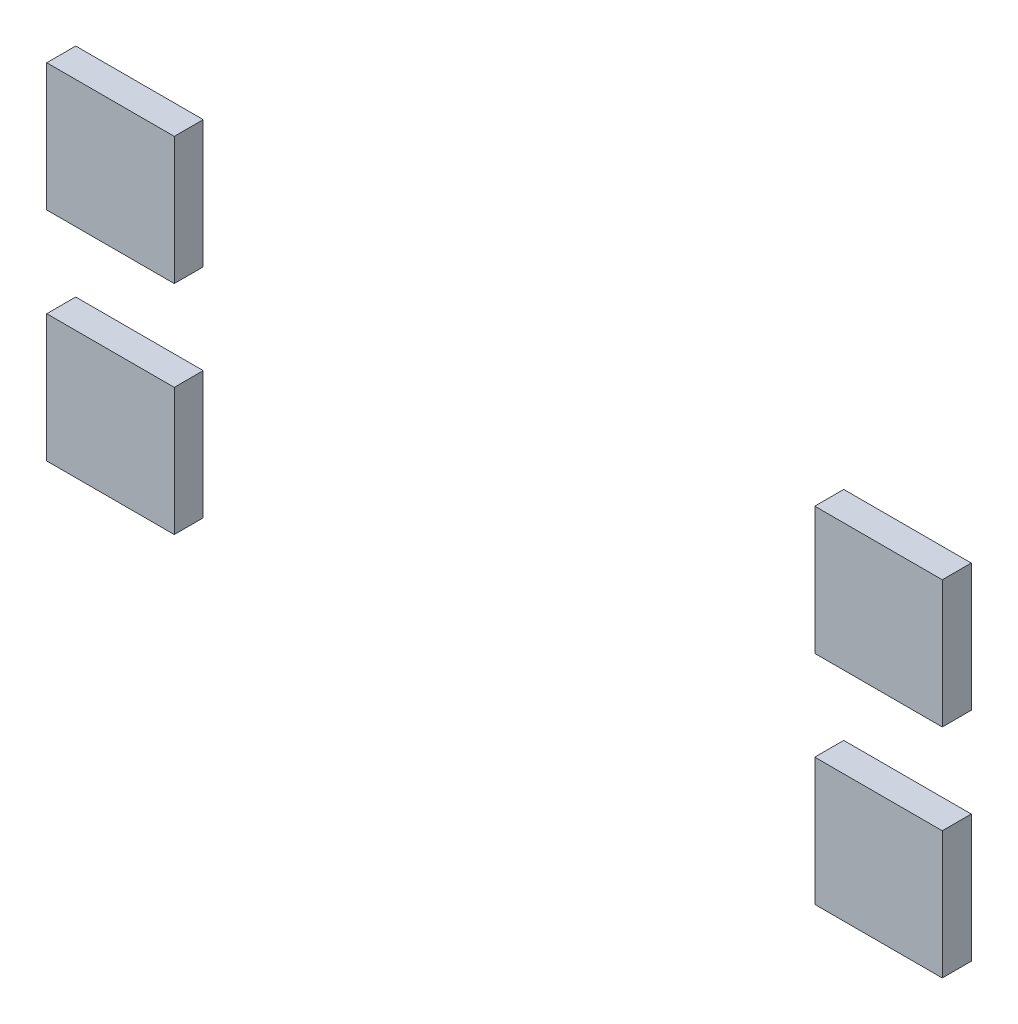
ISO-10303-21;
HEADER;
FILE_DESCRIPTION(('STEP AP214'),'2;1');
FILE_NAME('part.step','',(''),(''),'','','');
FILE_SCHEMA(('AUTOMOTIVE_DESIGN { 1 0 10303 214 1 1 1 1 }'));
ENDSEC;
DATA;
#1=APPLICATION_CONTEXT('core data for automotive mechanical design processes');
#2=APPLICATION_PROTOCOL_DEFINITION('international standard','automotive_design',2000,#1);
#3=PRODUCT_CONTEXT('',#1,'mechanical');
#4=PRODUCT('Part','Part','',(#3));
#5=PRODUCT_RELATED_PRODUCT_CATEGORY('part','',(#4));
#6=PRODUCT_DEFINITION_FORMATION('','',#4);
#7=PRODUCT_DEFINITION_CONTEXT('part definition',#1,'design');
#8=PRODUCT_DEFINITION('design','',#6,#7);
#9=PRODUCT_DEFINITION_SHAPE('','',#8);
#10=(LENGTH_UNIT() NAMED_UNIT(*) SI_UNIT(.MILLI.,.METRE.));
#11=(NAMED_UNIT(*) PLANE_ANGLE_UNIT() SI_UNIT($,.RADIAN.));
#12=(NAMED_UNIT(*) SI_UNIT($,.STERADIAN.) SOLID_ANGLE_UNIT());
#13=UNCERTAINTY_MEASURE_WITH_UNIT(LENGTH_MEASURE(1.E-05),#10,'distance_accuracy_value','');
#14=(GEOMETRIC_REPRESENTATION_CONTEXT(3) GLOBAL_UNCERTAINTY_ASSIGNED_CONTEXT((#13)) GLOBAL_UNIT_ASSIGNED_CONTEXT((#10,
#11,#12)) REPRESENTATION_CONTEXT('',''));
#15=CARTESIAN_POINT('',(0.,0.,0.));
#16=DIRECTION('',(0.,0.,1.));
#17=DIRECTION('',(1.,0.,0.));
#18=AXIS2_PLACEMENT_3D('',#15,#16,#17);
#19=CARTESIAN_POINT('',(-1.545,0.155,0.1));
#20=DIRECTION('',(0.,0.,1.));
#21=DIRECTION('',(1.,0.,0.));
#22=AXIS2_PLACEMENT_3D('',#19,#20,#21);
#23=PLANE('',#22);
#24=DIRECTION('',(0.,1.,0.));
#25=VECTOR('',#24,1.);
#26=CARTESIAN_POINT('',(-1.545,0.155,0.1));
#27=LINE('',#26,#25);
#28=CARTESIAN_POINT('',(-1.545,0.155,0.1));
#29=VERTEX_POINT('',#28);
#30=CARTESIAN_POINT('',(-1.545,0.595,0.1));
#31=VERTEX_POINT('',#30);
#32=EDGE_CURVE('P0_E94',#29,#31,#27,.T.);
#33=ORIENTED_EDGE('',*,*,#32,.F.);
#34=DIRECTION('',(1.,0.,0.));
#35=VECTOR('',#34,1.);
#36=CARTESIAN_POINT('',(-1.545,0.155,0.1));
#37=LINE('',#36,#35);
#38=CARTESIAN_POINT('',(-1.105,0.155,0.1));
#39=VERTEX_POINT('',#38);
#40=EDGE_CURVE('P0_E79',#29,#39,#37,.T.);
#41=ORIENTED_EDGE('',*,*,#40,.T.);
#42=DIRECTION('',(0.,1.,0.));
#43=VECTOR('',#42,1.);
#44=CARTESIAN_POINT('',(-1.105,0.155,0.1));
#45=LINE('',#44,#43);
#46=CARTESIAN_POINT('',(-1.105,0.595,0.1));
#47=VERTEX_POINT('',#46);
#48=EDGE_CURVE('P0_E80',#39,#47,#45,.T.);
#49=ORIENTED_EDGE('',*,*,#48,.T.);
#50=DIRECTION('',(1.,0.,0.));
#51=VECTOR('',#50,1.);
#52=CARTESIAN_POINT('',(-1.545,0.595,0.1));
#53=LINE('',#52,#51);
#54=EDGE_CURVE('P0_E11',#31,#47,#53,.T.);
#55=ORIENTED_EDGE('',*,*,#54,.F.);
#56=EDGE_LOOP('',(#33,#41,#49,#55));
#57=FACE_BOUND('',#56,.T.);
#58=ADVANCED_FACE('P0_F17',(#57),#23,.T.);
#59=CARTESIAN_POINT('',(-1.545,0.155,0.));
#60=DIRECTION('',(0.,0.,1.));
#61=DIRECTION('',(1.,0.,0.));
#62=AXIS2_PLACEMENT_3D('',#59,#60,#61);
#63=PLANE('',#62);
#64=DIRECTION('',(0.,1.,0.));
#65=VECTOR('',#64,1.);
#66=CARTESIAN_POINT('',(-1.545,0.155,0.));
#67=LINE('',#66,#65);
#68=CARTESIAN_POINT('',(-1.545,0.155,0.));
#69=VERTEX_POINT('',#68);
#70=CARTESIAN_POINT('',(-1.545,0.595,0.));
#71=VERTEX_POINT('',#70);
#72=EDGE_CURVE('P0_E70',#69,#71,#67,.T.);
#73=ORIENTED_EDGE('',*,*,#72,.T.);
#74=DIRECTION('',(1.,0.,0.));
#75=VECTOR('',#74,1.);
#76=CARTESIAN_POINT('',(-1.545,0.595,0.));
#77=LINE('',#76,#75);
#78=CARTESIAN_POINT('',(-1.105,0.595,0.));
#79=VERTEX_POINT('',#78);
#80=EDGE_CURVE('P0_E25',#71,#79,#77,.T.);
#81=ORIENTED_EDGE('',*,*,#80,.T.);
#82=DIRECTION('',(0.,1.,0.));
#83=VECTOR('',#82,1.);
#84=CARTESIAN_POINT('',(-1.105,0.155,0.));
#85=LINE('',#84,#83);
#86=CARTESIAN_POINT('',(-1.105,0.155,0.));
#87=VERTEX_POINT('',#86);
#88=EDGE_CURVE('P0_E73',#87,#79,#85,.T.);
#89=ORIENTED_EDGE('',*,*,#88,.F.);
#90=DIRECTION('',(1.,0.,0.));
#91=VECTOR('',#90,1.);
#92=CARTESIAN_POINT('',(-1.545,0.155,0.));
#93=LINE('',#92,#91);
#94=EDGE_CURVE('P0_E67',#69,#87,#93,.T.);
#95=ORIENTED_EDGE('',*,*,#94,.F.);
#96=EDGE_LOOP('',(#73,#81,#89,#95));
#97=FACE_BOUND('',#96,.T.);
#98=ADVANCED_FACE('P0_F69',(#97),#63,.F.);
#99=CARTESIAN_POINT('',(-1.545,0.595,0.));
#100=DIRECTION('',(0.,1.,0.));
#101=DIRECTION('',(1.,0.,0.));
#102=AXIS2_PLACEMENT_3D('',#99,#100,#101);
#103=PLANE('',#102);
#104=ORIENTED_EDGE('',*,*,#80,.F.);
#105=DIRECTION('',(0.,0.,1.));
#106=VECTOR('',#105,1.);
#107=CARTESIAN_POINT('',(-1.545,0.595,0.));
#108=LINE('',#107,#106);
#109=EDGE_CURVE('P0_E87',#71,#31,#108,.T.);
#110=ORIENTED_EDGE('',*,*,#109,.T.);
#111=ORIENTED_EDGE('',*,*,#54,.T.);
#112=DIRECTION('',(0.,0.,1.));
#113=VECTOR('',#112,1.);
#114=CARTESIAN_POINT('',(-1.105,0.595,0.));
#115=LINE('',#114,#113);
#116=EDGE_CURVE('P0_E105',#79,#47,#115,.T.);
#117=ORIENTED_EDGE('',*,*,#116,.F.);
#118=EDGE_LOOP('',(#104,#110,#111,#117));
#119=FACE_BOUND('',#118,.T.);
#120=ADVANCED_FACE('P0_F157',(#119),#103,.T.);
#121=CARTESIAN_POINT('',(-1.545,0.155,0.));
#122=DIRECTION('',(0.,1.,0.));
#123=DIRECTION('',(1.,0.,0.));
#124=AXIS2_PLACEMENT_3D('',#121,#122,#123);
#125=PLANE('',#124);
#126=ORIENTED_EDGE('',*,*,#94,.T.);
#127=DIRECTION('',(0.,0.,1.));
#128=VECTOR('',#127,1.);
#129=CARTESIAN_POINT('',(-1.105,0.155,0.));
#130=LINE('',#129,#128);
#131=EDGE_CURVE('P0_E89',#87,#39,#130,.T.);
#132=ORIENTED_EDGE('',*,*,#131,.T.);
#133=ORIENTED_EDGE('',*,*,#40,.F.);
#134=DIRECTION('',(0.,0.,1.));
#135=VECTOR('',#134,1.);
#136=CARTESIAN_POINT('',(-1.545,0.155,0.));
#137=LINE('',#136,#135);
#138=EDGE_CURVE('P0_E86',#69,#29,#137,.T.);
#139=ORIENTED_EDGE('',*,*,#138,.F.);
#140=EDGE_LOOP('',(#126,#132,#133,#139));
#141=FACE_BOUND('',#140,.T.);
#142=ADVANCED_FACE('P0_F91',(#141),#125,.F.);
#143=CARTESIAN_POINT('',(-1.105,0.155,0.));
#144=DIRECTION('',(1.,0.,0.));
#145=DIRECTION('',(0.,1.,0.));
#146=AXIS2_PLACEMENT_3D('',#143,#144,#145);
#147=PLANE('',#146);
#148=ORIENTED_EDGE('',*,*,#131,.F.);
#149=ORIENTED_EDGE('',*,*,#88,.T.);
#150=ORIENTED_EDGE('',*,*,#116,.T.);
#151=ORIENTED_EDGE('',*,*,#48,.F.);
#152=EDGE_LOOP('',(#148,#149,#150,#151));
#153=FACE_BOUND('',#152,.T.);
#154=ADVANCED_FACE('P0_F156',(#153),#147,.T.);
#155=CARTESIAN_POINT('',(-1.545,0.155,0.));
#156=DIRECTION('',(1.,0.,0.));
#157=DIRECTION('',(0.,1.,0.));
#158=AXIS2_PLACEMENT_3D('',#155,#156,#157);
#159=PLANE('',#158);
#160=ORIENTED_EDGE('',*,*,#138,.T.);
#161=ORIENTED_EDGE('',*,*,#32,.T.);
#162=ORIENTED_EDGE('',*,*,#109,.F.);
#163=ORIENTED_EDGE('',*,*,#72,.F.);
#164=EDGE_LOOP('',(#160,#161,#162,#163));
#165=FACE_BOUND('',#164,.T.);
#166=ADVANCED_FACE('P0_F84',(#165),#159,.F.);
#167=CLOSED_SHELL('',(#58,#98,#120,#142,#154,#166));
#168=MANIFOLD_SOLID_BREP('P0_B1',#167);
#169=CARTESIAN_POINT('',(1.105,0.155,0.1));
#170=DIRECTION('',(0.,0.,1.));
#171=DIRECTION('',(1.,0.,0.));
#172=AXIS2_PLACEMENT_3D('',#169,#170,#171);
#173=PLANE('',#172);
#174=DIRECTION('',(0.,1.,0.));
#175=VECTOR('',#174,1.);
#176=CARTESIAN_POINT('',(1.105,0.155,0.1));
#177=LINE('',#176,#175);
#178=CARTESIAN_POINT('',(1.105,0.155,0.1));
#179=VERTEX_POINT('',#178);
#180=CARTESIAN_POINT('',(1.105,0.595,0.1));
#181=VERTEX_POINT('',#180);
#182=EDGE_CURVE('P1_E115',#179,#181,#177,.T.);
#183=ORIENTED_EDGE('',*,*,#182,.F.);
#184=DIRECTION('',(1.,0.,0.));
#185=VECTOR('',#184,1.);
#186=CARTESIAN_POINT('',(1.105,0.155,0.1));
#187=LINE('',#186,#185);
#188=CARTESIAN_POINT('',(1.545,0.155,0.1));
#189=VERTEX_POINT('',#188);
#190=EDGE_CURVE('P1_E80',#179,#189,#187,.T.);
#191=ORIENTED_EDGE('',*,*,#190,.T.);
#192=DIRECTION('',(0.,1.,0.));
#193=VECTOR('',#192,1.);
#194=CARTESIAN_POINT('',(1.545,0.155,0.1));
#195=LINE('',#194,#193);
#196=CARTESIAN_POINT('',(1.545,0.595,0.1));
#197=VERTEX_POINT('',#196);
#198=EDGE_CURVE('P1_E81',#189,#197,#195,.T.);
#199=ORIENTED_EDGE('',*,*,#198,.T.);
#200=DIRECTION('',(1.,0.,0.));
#201=VECTOR('',#200,1.);
#202=CARTESIAN_POINT('',(1.105,0.595,0.1));
#203=LINE('',#202,#201);
#204=EDGE_CURVE('P1_E11',#181,#197,#203,.T.);
#205=ORIENTED_EDGE('',*,*,#204,.F.);
#206=EDGE_LOOP('',(#183,#191,#199,#205));
#207=FACE_BOUND('',#206,.T.);
#208=ADVANCED_FACE('P1_F17',(#207),#173,.T.);
#209=CARTESIAN_POINT('',(1.105,0.155,0.));
#210=DIRECTION('',(0.,0.,1.));
#211=DIRECTION('',(1.,0.,0.));
#212=AXIS2_PLACEMENT_3D('',#209,#210,#211);
#213=PLANE('',#212);
#214=DIRECTION('',(0.,1.,0.));
#215=VECTOR('',#214,1.);
#216=CARTESIAN_POINT('',(1.105,0.155,0.));
#217=LINE('',#216,#215);
#218=CARTESIAN_POINT('',(1.105,0.155,0.));
#219=VERTEX_POINT('',#218);
#220=CARTESIAN_POINT('',(1.105,0.595,0.));
#221=VERTEX_POINT('',#220);
#222=EDGE_CURVE('P1_E93',#219,#221,#217,.T.);
#223=ORIENTED_EDGE('',*,*,#222,.T.);
#224=DIRECTION('',(1.,0.,0.));
#225=VECTOR('',#224,1.);
#226=CARTESIAN_POINT('',(1.105,0.595,0.));
#227=LINE('',#226,#225);
#228=CARTESIAN_POINT('',(1.545,0.595,0.));
#229=VERTEX_POINT('',#228);
#230=EDGE_CURVE('P1_E21',#221,#229,#227,.T.);
#231=ORIENTED_EDGE('',*,*,#230,.T.);
#232=DIRECTION('',(0.,1.,0.));
#233=VECTOR('',#232,1.);
#234=CARTESIAN_POINT('',(1.545,0.155,0.));
#235=LINE('',#234,#233);
#236=CARTESIAN_POINT('',(1.545,0.155,0.));
#237=VERTEX_POINT('',#236);
#238=EDGE_CURVE('P1_E83',#237,#229,#235,.T.);
#239=ORIENTED_EDGE('',*,*,#238,.F.);
#240=DIRECTION('',(1.,0.,0.));
#241=VECTOR('',#240,1.);
#242=CARTESIAN_POINT('',(1.105,0.155,0.));
#243=LINE('',#242,#241);
#244=EDGE_CURVE('P1_E72',#219,#237,#243,.T.);
#245=ORIENTED_EDGE('',*,*,#244,.F.);
#246=EDGE_LOOP('',(#223,#231,#239,#245));
#247=FACE_BOUND('',#246,.T.);
#248=ADVANCED_FACE('P1_F84',(#247),#213,.F.);
#249=CARTESIAN_POINT('',(1.105,0.595,0.));
#250=DIRECTION('',(0.,1.,0.));
#251=DIRECTION('',(1.,0.,0.));
#252=AXIS2_PLACEMENT_3D('',#249,#250,#251);
#253=PLANE('',#252);
#254=ORIENTED_EDGE('',*,*,#230,.F.);
#255=DIRECTION('',(0.,0.,1.));
#256=VECTOR('',#255,1.);
#257=CARTESIAN_POINT('',(1.105,0.595,0.));
#258=LINE('',#257,#256);
#259=EDGE_CURVE('P1_E99',#221,#181,#258,.T.);
#260=ORIENTED_EDGE('',*,*,#259,.T.);
#261=ORIENTED_EDGE('',*,*,#204,.T.);
#262=DIRECTION('',(0.,0.,1.));
#263=VECTOR('',#262,1.);
#264=CARTESIAN_POINT('',(1.545,0.595,0.));
#265=LINE('',#264,#263);
#266=EDGE_CURVE('P1_E88',#229,#197,#265,.T.);
#267=ORIENTED_EDGE('',*,*,#266,.F.);
#268=EDGE_LOOP('',(#254,#260,#261,#267));
#269=FACE_BOUND('',#268,.T.);
#270=ADVANCED_FACE('P1_F19',(#269),#253,.T.);
#271=CARTESIAN_POINT('',(1.105,0.155,0.));
#272=DIRECTION('',(0.,1.,0.));
#273=DIRECTION('',(1.,0.,0.));
#274=AXIS2_PLACEMENT_3D('',#271,#272,#273);
#275=PLANE('',#274);
#276=ORIENTED_EDGE('',*,*,#244,.T.);
#277=DIRECTION('',(0.,0.,1.));
#278=VECTOR('',#277,1.);
#279=CARTESIAN_POINT('',(1.545,0.155,0.));
#280=LINE('',#279,#278);
#281=EDGE_CURVE('P1_E75',#237,#189,#280,.T.);
#282=ORIENTED_EDGE('',*,*,#281,.T.);
#283=ORIENTED_EDGE('',*,*,#190,.F.);
#284=DIRECTION('',(0.,0.,1.));
#285=VECTOR('',#284,1.);
#286=CARTESIAN_POINT('',(1.105,0.155,0.));
#287=LINE('',#286,#285);
#288=EDGE_CURVE('P1_E77',#219,#179,#287,.T.);
#289=ORIENTED_EDGE('',*,*,#288,.F.);
#290=EDGE_LOOP('',(#276,#282,#283,#289));
#291=FACE_BOUND('',#290,.T.);
#292=ADVANCED_FACE('P1_F73',(#291),#275,.F.);
#293=CARTESIAN_POINT('',(1.545,0.155,0.));
#294=DIRECTION('',(1.,0.,0.));
#295=DIRECTION('',(0.,1.,0.));
#296=AXIS2_PLACEMENT_3D('',#293,#294,#295);
#297=PLANE('',#296);
#298=ORIENTED_EDGE('',*,*,#281,.F.);
#299=ORIENTED_EDGE('',*,*,#238,.T.);
#300=ORIENTED_EDGE('',*,*,#266,.T.);
#301=ORIENTED_EDGE('',*,*,#198,.F.);
#302=EDGE_LOOP('',(#298,#299,#300,#301));
#303=FACE_BOUND('',#302,.T.);
#304=ADVANCED_FACE('P1_F91',(#303),#297,.T.);
#305=CARTESIAN_POINT('',(1.105,0.155,0.));
#306=DIRECTION('',(1.,0.,0.));
#307=DIRECTION('',(0.,1.,0.));
#308=AXIS2_PLACEMENT_3D('',#305,#306,#307);
#309=PLANE('',#308);
#310=ORIENTED_EDGE('',*,*,#288,.T.);
#311=ORIENTED_EDGE('',*,*,#182,.T.);
#312=ORIENTED_EDGE('',*,*,#259,.F.);
#313=ORIENTED_EDGE('',*,*,#222,.F.);
#314=EDGE_LOOP('',(#310,#311,#312,#313));
#315=FACE_BOUND('',#314,.T.);
#316=ADVANCED_FACE('P1_F114',(#315),#309,.F.);
#317=CLOSED_SHELL('',(#208,#248,#270,#292,#304,#316));
#318=MANIFOLD_SOLID_BREP('P1_B1',#317);
#319=CARTESIAN_POINT('',(-1.545,-0.595,0.1));
#320=DIRECTION('',(0.,0.,1.));
#321=DIRECTION('',(1.,0.,0.));
#322=AXIS2_PLACEMENT_3D('',#319,#320,#321);
#323=PLANE('',#322);
#324=DIRECTION('',(0.,1.,0.));
#325=VECTOR('',#324,1.);
#326=CARTESIAN_POINT('',(-1.545,-0.595,0.1));
#327=LINE('',#326,#325);
#328=CARTESIAN_POINT('',(-1.545,-0.595,0.1));
#329=VERTEX_POINT('',#328);
#330=CARTESIAN_POINT('',(-1.545,-0.155,0.1));
#331=VERTEX_POINT('',#330);
#332=EDGE_CURVE('P2_E92',#329,#331,#327,.T.);
#333=ORIENTED_EDGE('',*,*,#332,.F.);
#334=DIRECTION('',(1.,0.,0.));
#335=VECTOR('',#334,1.);
#336=CARTESIAN_POINT('',(-1.545,-0.595,0.1));
#337=LINE('',#336,#335);
#338=CARTESIAN_POINT('',(-1.105,-0.595,0.1));
#339=VERTEX_POINT('',#338);
#340=EDGE_CURVE('P2_E78',#329,#339,#337,.T.);
#341=ORIENTED_EDGE('',*,*,#340,.T.);
#342=DIRECTION('',(0.,1.,0.));
#343=VECTOR('',#342,1.);
#344=CARTESIAN_POINT('',(-1.105,-0.595,0.1));
#345=LINE('',#344,#343);
#346=CARTESIAN_POINT('',(-1.105,-0.155,0.1));
#347=VERTEX_POINT('',#346);
#348=EDGE_CURVE('P2_E79',#339,#347,#345,.T.);
#349=ORIENTED_EDGE('',*,*,#348,.T.);
#350=DIRECTION('',(1.,0.,0.));
#351=VECTOR('',#350,1.);
#352=CARTESIAN_POINT('',(-1.545,-0.155,0.1));
#353=LINE('',#352,#351);
#354=EDGE_CURVE('P2_E11',#331,#347,#353,.T.);
#355=ORIENTED_EDGE('',*,*,#354,.F.);
#356=EDGE_LOOP('',(#333,#341,#349,#355));
#357=FACE_BOUND('',#356,.T.);
#358=ADVANCED_FACE('P2_F17',(#357),#323,.T.);
#359=CARTESIAN_POINT('',(-1.545,-0.595,0.));
#360=DIRECTION('',(0.,0.,1.));
#361=DIRECTION('',(1.,0.,0.));
#362=AXIS2_PLACEMENT_3D('',#359,#360,#361);
#363=PLANE('',#362);
#364=DIRECTION('',(0.,1.,0.));
#365=VECTOR('',#364,1.);
#366=CARTESIAN_POINT('',(-1.545,-0.595,0.));
#367=LINE('',#366,#365);
#368=CARTESIAN_POINT('',(-1.545,-0.595,0.));
#369=VERTEX_POINT('',#368);
#370=CARTESIAN_POINT('',(-1.545,-0.155,0.));
#371=VERTEX_POINT('',#370);
#372=EDGE_CURVE('P2_E69',#369,#371,#367,.T.);
#373=ORIENTED_EDGE('',*,*,#372,.T.);
#374=DIRECTION('',(1.,0.,0.));
#375=VECTOR('',#374,1.);
#376=CARTESIAN_POINT('',(-1.545,-0.155,0.));
#377=LINE('',#376,#375);
#378=CARTESIAN_POINT('',(-1.105,-0.155,0.));
#379=VERTEX_POINT('',#378);
#380=EDGE_CURVE('P2_E27',#371,#379,#377,.T.);
#381=ORIENTED_EDGE('',*,*,#380,.T.);
#382=DIRECTION('',(0.,1.,0.));
#383=VECTOR('',#382,1.);
#384=CARTESIAN_POINT('',(-1.105,-0.595,0.));
#385=LINE('',#384,#383);
#386=CARTESIAN_POINT('',(-1.105,-0.595,0.));
#387=VERTEX_POINT('',#386);
#388=EDGE_CURVE('P2_E72',#387,#379,#385,.T.);
#389=ORIENTED_EDGE('',*,*,#388,.F.);
#390=DIRECTION('',(1.,0.,0.));
#391=VECTOR('',#390,1.);
#392=CARTESIAN_POINT('',(-1.545,-0.595,0.));
#393=LINE('',#392,#391);
#394=EDGE_CURVE('P2_E20',#369,#387,#393,.T.);
#395=ORIENTED_EDGE('',*,*,#394,.F.);
#396=EDGE_LOOP('',(#373,#381,#389,#395));
#397=FACE_BOUND('',#396,.T.);
#398=ADVANCED_FACE('P2_F68',(#397),#363,.F.);
#399=CARTESIAN_POINT('',(-1.545,-0.155,0.));
#400=DIRECTION('',(0.,1.,0.));
#401=DIRECTION('',(1.,0.,0.));
#402=AXIS2_PLACEMENT_3D('',#399,#400,#401);
#403=PLANE('',#402);
#404=ORIENTED_EDGE('',*,*,#380,.F.);
#405=DIRECTION('',(0.,0.,1.));
#406=VECTOR('',#405,1.);
#407=CARTESIAN_POINT('',(-1.545,-0.155,0.));
#408=LINE('',#407,#406);
#409=EDGE_CURVE('P2_E85',#371,#331,#408,.T.);
#410=ORIENTED_EDGE('',*,*,#409,.T.);
#411=ORIENTED_EDGE('',*,*,#354,.T.);
#412=DIRECTION('',(0.,0.,1.));
#413=VECTOR('',#412,1.);
#414=CARTESIAN_POINT('',(-1.105,-0.155,0.));
#415=LINE('',#414,#413);
#416=EDGE_CURVE('P2_E110',#379,#347,#415,.T.);
#417=ORIENTED_EDGE('',*,*,#416,.F.);
#418=EDGE_LOOP('',(#404,#410,#411,#417));
#419=FACE_BOUND('',#418,.T.);
#420=ADVANCED_FACE('P2_F120',(#419),#403,.T.);
#421=CARTESIAN_POINT('',(-1.545,-0.595,0.));
#422=DIRECTION('',(0.,1.,0.));
#423=DIRECTION('',(1.,0.,0.));
#424=AXIS2_PLACEMENT_3D('',#421,#422,#423);
#425=PLANE('',#424);
#426=ORIENTED_EDGE('',*,*,#394,.T.);
#427=DIRECTION('',(0.,0.,1.));
#428=VECTOR('',#427,1.);
#429=CARTESIAN_POINT('',(-1.105,-0.595,0.));
#430=LINE('',#429,#428);
#431=EDGE_CURVE('P2_E87',#387,#339,#430,.T.);
#432=ORIENTED_EDGE('',*,*,#431,.T.);
#433=ORIENTED_EDGE('',*,*,#340,.F.);
#434=DIRECTION('',(0.,0.,1.));
#435=VECTOR('',#434,1.);
#436=CARTESIAN_POINT('',(-1.545,-0.595,0.));
#437=LINE('',#436,#435);
#438=EDGE_CURVE('P2_E84',#369,#329,#437,.T.);
#439=ORIENTED_EDGE('',*,*,#438,.F.);
#440=EDGE_LOOP('',(#426,#432,#433,#439));
#441=FACE_BOUND('',#440,.T.);
#442=ADVANCED_FACE('P2_F89',(#441),#425,.F.);
#443=CARTESIAN_POINT('',(-1.105,-0.595,0.));
#444=DIRECTION('',(1.,0.,0.));
#445=DIRECTION('',(0.,1.,0.));
#446=AXIS2_PLACEMENT_3D('',#443,#444,#445);
#447=PLANE('',#446);
#448=ORIENTED_EDGE('',*,*,#431,.F.);
#449=ORIENTED_EDGE('',*,*,#388,.T.);
#450=ORIENTED_EDGE('',*,*,#416,.T.);
#451=ORIENTED_EDGE('',*,*,#348,.F.);
#452=EDGE_LOOP('',(#448,#449,#450,#451));
#453=FACE_BOUND('',#452,.T.);
#454=ADVANCED_FACE('P2_F119',(#453),#447,.T.);
#455=CARTESIAN_POINT('',(-1.545,-0.595,0.));
#456=DIRECTION('',(1.,0.,0.));
#457=DIRECTION('',(0.,1.,0.));
#458=AXIS2_PLACEMENT_3D('',#455,#456,#457);
#459=PLANE('',#458);
#460=ORIENTED_EDGE('',*,*,#438,.T.);
#461=ORIENTED_EDGE('',*,*,#332,.T.);
#462=ORIENTED_EDGE('',*,*,#409,.F.);
#463=ORIENTED_EDGE('',*,*,#372,.F.);
#464=EDGE_LOOP('',(#460,#461,#462,#463));
#465=FACE_BOUND('',#464,.T.);
#466=ADVANCED_FACE('P2_F82',(#465),#459,.F.);
#467=CLOSED_SHELL('',(#358,#398,#420,#442,#454,#466));
#468=MANIFOLD_SOLID_BREP('P2_B1',#467);
#469=CARTESIAN_POINT('',(1.105,-0.595,0.1));
#470=DIRECTION('',(0.,0.,1.));
#471=DIRECTION('',(1.,0.,0.));
#472=AXIS2_PLACEMENT_3D('',#469,#470,#471);
#473=PLANE('',#472);
#474=DIRECTION('',(0.,1.,0.));
#475=VECTOR('',#474,1.);
#476=CARTESIAN_POINT('',(1.105,-0.595,0.1));
#477=LINE('',#476,#475);
#478=CARTESIAN_POINT('',(1.105,-0.595,0.1));
#479=VERTEX_POINT('',#478);
#480=CARTESIAN_POINT('',(1.105,-0.155,0.1));
#481=VERTEX_POINT('',#480);
#482=EDGE_CURVE('P3_E64',#479,#481,#477,.T.);
#483=ORIENTED_EDGE('',*,*,#482,.F.);
#484=DIRECTION('',(1.,0.,0.));
#485=VECTOR('',#484,1.);
#486=CARTESIAN_POINT('',(1.105,-0.595,0.1));
#487=LINE('',#486,#485);
#488=CARTESIAN_POINT('',(1.545,-0.595,0.1));
#489=VERTEX_POINT('',#488);
#490=EDGE_CURVE('P3_E58',#479,#489,#487,.T.);
#491=ORIENTED_EDGE('',*,*,#490,.T.);
#492=DIRECTION('',(0.,1.,0.));
#493=VECTOR('',#492,1.);
#494=CARTESIAN_POINT('',(1.545,-0.595,0.1));
#495=LINE('',#494,#493);
#496=CARTESIAN_POINT('',(1.545,-0.155,0.1));
#497=VERTEX_POINT('',#496);
#498=EDGE_CURVE('P3_E60',#489,#497,#495,.T.);
#499=ORIENTED_EDGE('',*,*,#498,.T.);
#500=DIRECTION('',(1.,0.,0.));
#501=VECTOR('',#500,1.);
#502=CARTESIAN_POINT('',(1.105,-0.155,0.1));
#503=LINE('',#502,#501);
#504=EDGE_CURVE('P3_E11',#481,#497,#503,.T.);
#505=ORIENTED_EDGE('',*,*,#504,.F.);
#506=EDGE_LOOP('',(#483,#491,#499,#505));
#507=FACE_BOUND('',#506,.T.);
#508=ADVANCED_FACE('P3_F17',(#507),#473,.T.);
#509=CARTESIAN_POINT('',(1.105,-0.595,0.));
#510=DIRECTION('',(0.,0.,1.));
#511=DIRECTION('',(1.,0.,0.));
#512=AXIS2_PLACEMENT_3D('',#509,#510,#511);
#513=PLANE('',#512);
#514=DIRECTION('',(0.,1.,0.));
#515=VECTOR('',#514,1.);
#516=CARTESIAN_POINT('',(1.105,-0.595,0.));
#517=LINE('',#516,#515);
#518=CARTESIAN_POINT('',(1.105,-0.595,0.));
#519=VERTEX_POINT('',#518);
#520=CARTESIAN_POINT('',(1.105,-0.155,0.));
#521=VERTEX_POINT('',#520);
#522=EDGE_CURVE('P3_E85',#519,#521,#517,.T.);
#523=ORIENTED_EDGE('',*,*,#522,.T.);
#524=DIRECTION('',(1.,0.,0.));
#525=VECTOR('',#524,1.);
#526=CARTESIAN_POINT('',(1.105,-0.155,0.));
#527=LINE('',#526,#525);
#528=CARTESIAN_POINT('',(1.545,-0.155,0.));
#529=VERTEX_POINT('',#528);
#530=EDGE_CURVE('P3_E27',#521,#529,#527,.T.);
#531=ORIENTED_EDGE('',*,*,#530,.T.);
#532=DIRECTION('',(0.,1.,0.));
#533=VECTOR('',#532,1.);
#534=CARTESIAN_POINT('',(1.545,-0.595,0.));
#535=LINE('',#534,#533);
#536=CARTESIAN_POINT('',(1.545,-0.595,0.));
#537=VERTEX_POINT('',#536);
#538=EDGE_CURVE('P3_E84',#537,#529,#535,.T.);
#539=ORIENTED_EDGE('',*,*,#538,.F.);
#540=DIRECTION('',(1.,0.,0.));
#541=VECTOR('',#540,1.);
#542=CARTESIAN_POINT('',(1.105,-0.595,0.));
#543=LINE('',#542,#541);
#544=EDGE_CURVE('P3_E70',#519,#537,#543,.T.);
#545=ORIENTED_EDGE('',*,*,#544,.F.);
#546=EDGE_LOOP('',(#523,#531,#539,#545));
#547=FACE_BOUND('',#546,.T.);
#548=ADVANCED_FACE('P3_F19',(#547),#513,.F.);
#549=CARTESIAN_POINT('',(1.105,-0.155,0.));
#550=DIRECTION('',(0.,1.,0.));
#551=DIRECTION('',(1.,0.,0.));
#552=AXIS2_PLACEMENT_3D('',#549,#550,#551);
#553=PLANE('',#552);
#554=ORIENTED_EDGE('',*,*,#530,.F.);
#555=DIRECTION('',(0.,0.,1.));
#556=VECTOR('',#555,1.);
#557=CARTESIAN_POINT('',(1.105,-0.155,0.));
#558=LINE('',#557,#556);
#559=EDGE_CURVE('P3_E94',#521,#481,#558,.T.);
#560=ORIENTED_EDGE('',*,*,#559,.T.);
#561=ORIENTED_EDGE('',*,*,#504,.T.);
#562=DIRECTION('',(0.,0.,1.));
#563=VECTOR('',#562,1.);
#564=CARTESIAN_POINT('',(1.545,-0.155,0.));
#565=LINE('',#564,#563);
#566=EDGE_CURVE('P3_E77',#529,#497,#565,.T.);
#567=ORIENTED_EDGE('',*,*,#566,.F.);
#568=EDGE_LOOP('',(#554,#560,#561,#567));
#569=FACE_BOUND('',#568,.T.);
#570=ADVANCED_FACE('P3_F157',(#569),#553,.T.);
#571=CARTESIAN_POINT('',(1.105,-0.595,0.));
#572=DIRECTION('',(0.,1.,0.));
#573=DIRECTION('',(1.,0.,0.));
#574=AXIS2_PLACEMENT_3D('',#571,#572,#573);
#575=PLANE('',#574);
#576=ORIENTED_EDGE('',*,*,#544,.T.);
#577=DIRECTION('',(0.,0.,1.));
#578=VECTOR('',#577,1.);
#579=CARTESIAN_POINT('',(1.545,-0.595,0.));
#580=LINE('',#579,#578);
#581=EDGE_CURVE('P3_E76',#537,#489,#580,.T.);
#582=ORIENTED_EDGE('',*,*,#581,.T.);
#583=ORIENTED_EDGE('',*,*,#490,.F.);
#584=DIRECTION('',(0.,0.,1.));
#585=VECTOR('',#584,1.);
#586=CARTESIAN_POINT('',(1.105,-0.595,0.));
#587=LINE('',#586,#585);
#588=EDGE_CURVE('P3_E206',#519,#479,#587,.T.);
#589=ORIENTED_EDGE('',*,*,#588,.F.);
#590=EDGE_LOOP('',(#576,#582,#583,#589));
#591=FACE_BOUND('',#590,.T.);
#592=ADVANCED_FACE('P3_F80',(#591),#575,.F.);
#593=CARTESIAN_POINT('',(1.545,-0.595,0.));
#594=DIRECTION('',(1.,0.,0.));
#595=DIRECTION('',(0.,1.,0.));
#596=AXIS2_PLACEMENT_3D('',#593,#594,#595);
#597=PLANE('',#596);
#598=ORIENTED_EDGE('',*,*,#581,.F.);
#599=ORIENTED_EDGE('',*,*,#538,.T.);
#600=ORIENTED_EDGE('',*,*,#566,.T.);
#601=ORIENTED_EDGE('',*,*,#498,.F.);
#602=EDGE_LOOP('',(#598,#599,#600,#601));
#603=FACE_BOUND('',#602,.T.);
#604=ADVANCED_FACE('P3_F74',(#603),#597,.T.);
#605=CARTESIAN_POINT('',(1.105,-0.595,0.));
#606=DIRECTION('',(1.,0.,0.));
#607=DIRECTION('',(0.,1.,0.));
#608=AXIS2_PLACEMENT_3D('',#605,#606,#607);
#609=PLANE('',#608);
#610=ORIENTED_EDGE('',*,*,#588,.T.);
#611=ORIENTED_EDGE('',*,*,#482,.T.);
#612=ORIENTED_EDGE('',*,*,#559,.F.);
#613=ORIENTED_EDGE('',*,*,#522,.F.);
#614=EDGE_LOOP('',(#610,#611,#612,#613));
#615=FACE_BOUND('',#614,.T.);
#616=ADVANCED_FACE('P3_F130',(#615),#609,.F.);
#617=CLOSED_SHELL('',(#508,#548,#570,#592,#604,#616));
#618=MANIFOLD_SOLID_BREP('P3_B1',#617);
#619=ADVANCED_BREP_SHAPE_REPRESENTATION('',(#18,#168,#318,#468,#618),#14);
#620=SHAPE_DEFINITION_REPRESENTATION(#9,#619);
ENDSEC;
END-ISO-10303-21;
